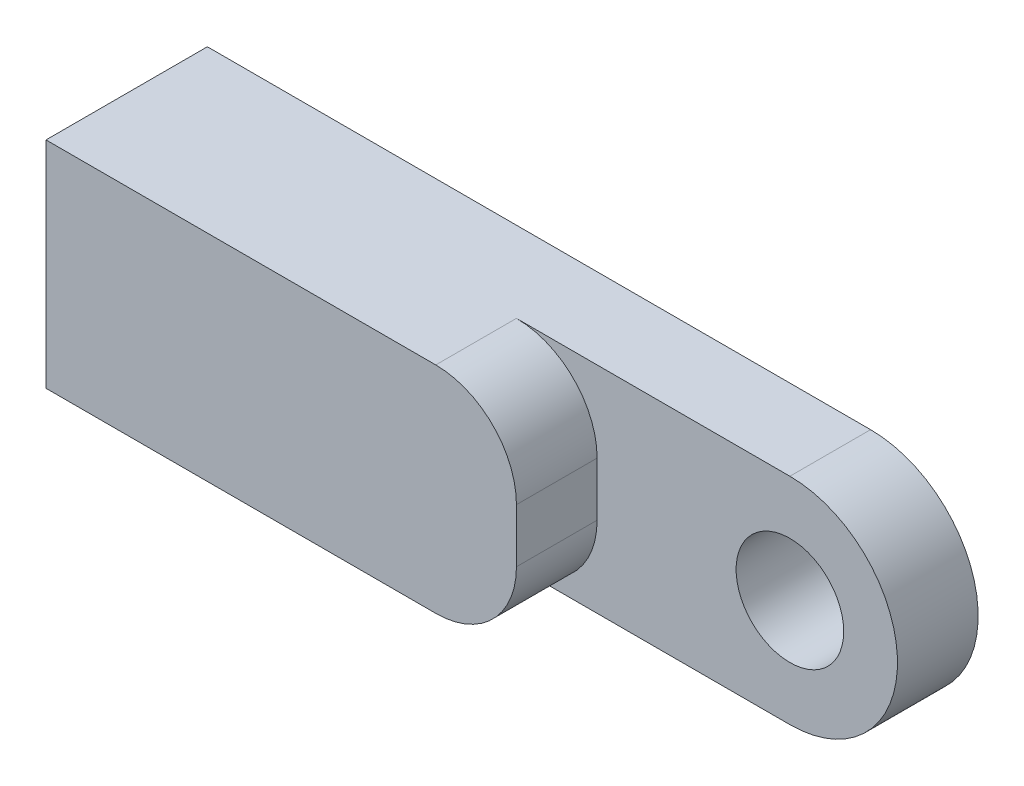
ISO-10303-21;
HEADER;
FILE_DESCRIPTION(('STEP AP214'),'2;1');
FILE_NAME('part.step','',(''),(''),'','','');
FILE_SCHEMA(('AUTOMOTIVE_DESIGN { 1 0 10303 214 1 1 1 1 }'));
ENDSEC;
DATA;
#1=APPLICATION_CONTEXT('core data for automotive mechanical design processes');
#2=APPLICATION_PROTOCOL_DEFINITION('international standard','automotive_design',2000,#1);
#3=PRODUCT_CONTEXT('',#1,'mechanical');
#4=PRODUCT('Part','Part','',(#3));
#5=PRODUCT_RELATED_PRODUCT_CATEGORY('part','',(#4));
#6=PRODUCT_DEFINITION_FORMATION('','',#4);
#7=PRODUCT_DEFINITION_CONTEXT('part definition',#1,'design');
#8=PRODUCT_DEFINITION('design','',#6,#7);
#9=PRODUCT_DEFINITION_SHAPE('','',#8);
#10=(LENGTH_UNIT() NAMED_UNIT(*) SI_UNIT(.MILLI.,.METRE.));
#11=(NAMED_UNIT(*) PLANE_ANGLE_UNIT() SI_UNIT($,.RADIAN.));
#12=(NAMED_UNIT(*) SI_UNIT($,.STERADIAN.) SOLID_ANGLE_UNIT());
#13=UNCERTAINTY_MEASURE_WITH_UNIT(LENGTH_MEASURE(1.E-05),#10,'distance_accuracy_value','');
#14=(GEOMETRIC_REPRESENTATION_CONTEXT(3) GLOBAL_UNCERTAINTY_ASSIGNED_CONTEXT((#13)) GLOBAL_UNIT_ASSIGNED_CONTEXT((#10,
#11,#12)) REPRESENTATION_CONTEXT('',''));
#15=CARTESIAN_POINT('',(0.,0.,0.));
#16=DIRECTION('',(0.,0.,1.));
#17=DIRECTION('',(1.,0.,0.));
#18=AXIS2_PLACEMENT_3D('',#15,#16,#17);
#19=CARTESIAN_POINT('',(125.,0.,60.));
#20=DIRECTION('',(0.,0.,-1.));
#21=DIRECTION('',(-1.,0.,0.));
#22=AXIS2_PLACEMENT_3D('',#19,#20,#21);
#23=CYLINDRICAL_SURFACE('',#22,40.);
#24=CARTESIAN_POINT('',(125.,0.,30.));
#25=DIRECTION('',(0.,0.,1.));
#26=DIRECTION('',(1.,0.,0.));
#27=AXIS2_PLACEMENT_3D('',#24,#25,#26);
#28=CIRCLE('',#27,40.);
#29=CARTESIAN_POINT('',(125.,-40.,30.));
#30=VERTEX_POINT('',#29);
#31=CARTESIAN_POINT('',(125.,40.,30.));
#32=VERTEX_POINT('',#31);
#33=EDGE_CURVE('E195',#30,#32,#28,.T.);
#34=ORIENTED_EDGE('',*,*,#33,.F.);
#35=DIRECTION('',(0.,0.,-1.));
#36=VECTOR('',#35,1.);
#37=CARTESIAN_POINT('',(125.,-40.,60.));
#38=LINE('',#37,#36);
#39=CARTESIAN_POINT('',(125.,-40.,0.));
#40=VERTEX_POINT('',#39);
#41=EDGE_CURVE('E149',#30,#40,#38,.T.);
#42=ORIENTED_EDGE('',*,*,#41,.T.);
#43=CARTESIAN_POINT('',(125.,0.,0.));
#44=DIRECTION('',(0.,0.,1.));
#45=DIRECTION('',(1.,0.,0.));
#46=AXIS2_PLACEMENT_3D('',#43,#44,#45);
#47=CIRCLE('',#46,40.);
#48=CARTESIAN_POINT('',(125.,40.,0.));
#49=VERTEX_POINT('',#48);
#50=EDGE_CURVE('E135',#40,#49,#47,.T.);
#51=ORIENTED_EDGE('',*,*,#50,.T.);
#52=DIRECTION('',(0.,0.,-1.));
#53=VECTOR('',#52,1.);
#54=CARTESIAN_POINT('',(125.,40.,60.));
#55=LINE('',#54,#53);
#56=EDGE_CURVE('E150',#32,#49,#55,.T.);
#57=ORIENTED_EDGE('',*,*,#56,.F.);
#58=EDGE_LOOP('',(#34,#42,#51,#57));
#59=FACE_BOUND('',#58,.T.);
#60=ADVANCED_FACE('F44',(#59),#23,.T.);
#61=CARTESIAN_POINT('',(125.,0.,60.));
#62=DIRECTION('',(0.,0.,-1.));
#63=DIRECTION('',(-1.,0.,0.));
#64=AXIS2_PLACEMENT_3D('',#61,#62,#63);
#65=CYLINDRICAL_SURFACE('',#64,20.);
#66=CARTESIAN_POINT('',(125.,0.,0.));
#67=DIRECTION('',(0.,0.,1.));
#68=DIRECTION('',(1.,0.,0.));
#69=AXIS2_PLACEMENT_3D('',#66,#67,#68);
#70=CIRCLE('',#69,20.);
#71=CARTESIAN_POINT('',(145.,0.,0.));
#72=VERTEX_POINT('',#71);
#73=EDGE_CURVE('E137',#72,#72,#70,.T.);
#74=ORIENTED_EDGE('',*,*,#73,.F.);
#75=EDGE_LOOP('',(#74));
#76=FACE_BOUND('',#75,.T.);
#77=CARTESIAN_POINT('',(125.,0.,30.));
#78=DIRECTION('',(0.,0.,1.));
#79=DIRECTION('',(1.,0.,0.));
#80=AXIS2_PLACEMENT_3D('',#77,#78,#79);
#81=CIRCLE('',#80,20.);
#82=CARTESIAN_POINT('',(145.,0.,30.));
#83=VERTEX_POINT('',#82);
#84=EDGE_CURVE('E151',#83,#83,#81,.T.);
#85=ORIENTED_EDGE('',*,*,#84,.T.);
#86=EDGE_LOOP('',(#85));
#87=FACE_BOUND('',#86,.T.);
#88=ADVANCED_FACE('F206',(#76,#87),#65,.F.);
#89=CARTESIAN_POINT('',(-150.,0.,60.));
#90=DIRECTION('',(0.,0.,1.));
#91=DIRECTION('',(1.,0.,0.));
#92=AXIS2_PLACEMENT_3D('',#89,#90,#91);
#93=PLANE('',#92);
#94=DIRECTION('',(0.,-1.,0.));
#95=VECTOR('',#94,1.);
#96=CARTESIAN_POINT('',(53.3156408290106,-40.,60.));
#97=LINE('',#96,#95);
#98=CARTESIAN_POINT('',(53.3156408290106,10.,60.));
#99=VERTEX_POINT('',#98);
#100=CARTESIAN_POINT('',(53.3156408290106,-10.,60.));
#101=VERTEX_POINT('',#100);
#102=EDGE_CURVE('E185',#99,#101,#97,.T.);
#103=ORIENTED_EDGE('',*,*,#102,.F.);
#104=CARTESIAN_POINT('',(23.3156408290106,10.,60.));
#105=DIRECTION('',(0.,0.,1.));
#106=DIRECTION('',(1.,0.,0.));
#107=AXIS2_PLACEMENT_3D('',#104,#105,#106);
#108=CIRCLE('',#107,30.);
#109=CARTESIAN_POINT('',(23.3156408290106,40.,60.));
#110=VERTEX_POINT('',#109);
#111=EDGE_CURVE('E165',#99,#110,#108,.T.);
#112=ORIENTED_EDGE('',*,*,#111,.T.);
#113=DIRECTION('',(-1.,0.,0.));
#114=VECTOR('',#113,1.);
#115=CARTESIAN_POINT('',(-150.,40.,60.));
#116=LINE('',#115,#114);
#117=CARTESIAN_POINT('',(-121.611968519616,40.,60.));
#118=VERTEX_POINT('',#117);
#119=EDGE_CURVE('E141',#110,#118,#116,.T.);
#120=ORIENTED_EDGE('',*,*,#119,.T.);
#121=DIRECTION('',(0.,-1.,0.));
#122=VECTOR('',#121,1.);
#123=CARTESIAN_POINT('',(-121.611968519616,91.0000000000001,60.));
#124=LINE('',#123,#122);
#125=CARTESIAN_POINT('',(-121.611968519616,-40.,60.));
#126=VERTEX_POINT('',#125);
#127=EDGE_CURVE('E122',#118,#126,#124,.T.);
#128=ORIENTED_EDGE('',*,*,#127,.T.);
#129=DIRECTION('',(1.,0.,0.));
#130=VECTOR('',#129,1.);
#131=CARTESIAN_POINT('',(-150.,-40.,60.));
#132=LINE('',#131,#130);
#133=CARTESIAN_POINT('',(23.3156408290106,-40.,60.));
#134=VERTEX_POINT('',#133);
#135=EDGE_CURVE('E126',#126,#134,#132,.T.);
#136=ORIENTED_EDGE('',*,*,#135,.T.);
#137=CARTESIAN_POINT('',(23.3156408290106,-10.,60.));
#138=DIRECTION('',(0.,0.,1.));
#139=DIRECTION('',(1.,0.,0.));
#140=AXIS2_PLACEMENT_3D('',#137,#138,#139);
#141=CIRCLE('',#140,30.);
#142=EDGE_CURVE('E159',#134,#101,#141,.T.);
#143=ORIENTED_EDGE('',*,*,#142,.T.);
#144=EDGE_LOOP('',(#103,#112,#120,#128,#136,#143));
#145=FACE_BOUND('',#144,.T.);
#146=ADVANCED_FACE('F187',(#145),#93,.T.);
#147=CARTESIAN_POINT('',(-150.,0.,0.));
#148=DIRECTION('',(0.,0.,1.));
#149=DIRECTION('',(1.,0.,0.));
#150=AXIS2_PLACEMENT_3D('',#147,#148,#149);
#151=PLANE('',#150);
#152=DIRECTION('',(1.,0.,0.));
#153=VECTOR('',#152,1.);
#154=CARTESIAN_POINT('',(-150.,-40.,0.));
#155=LINE('',#154,#153);
#156=CARTESIAN_POINT('',(-121.611968519616,-40.,0.));
#157=VERTEX_POINT('',#156);
#158=EDGE_CURVE('E121',#157,#40,#155,.T.);
#159=ORIENTED_EDGE('',*,*,#158,.F.);
#160=DIRECTION('',(0.,-1.,0.));
#161=VECTOR('',#160,1.);
#162=CARTESIAN_POINT('',(-121.611968519616,91.0000000000001,0.));
#163=LINE('',#162,#161);
#164=CARTESIAN_POINT('',(-121.611968519616,40.,0.));
#165=VERTEX_POINT('',#164);
#166=EDGE_CURVE('E108',#165,#157,#163,.T.);
#167=ORIENTED_EDGE('',*,*,#166,.F.);
#168=DIRECTION('',(-1.,0.,0.));
#169=VECTOR('',#168,1.);
#170=CARTESIAN_POINT('',(-150.,40.,0.));
#171=LINE('',#170,#169);
#172=EDGE_CURVE('E138',#49,#165,#171,.T.);
#173=ORIENTED_EDGE('',*,*,#172,.F.);
#174=ORIENTED_EDGE('',*,*,#50,.F.);
#175=EDGE_LOOP('',(#159,#167,#173,#174));
#176=FACE_BOUND('',#175,.T.);
#177=ORIENTED_EDGE('',*,*,#73,.T.);
#178=EDGE_LOOP('',(#177));
#179=FACE_BOUND('',#178,.T.);
#180=ADVANCED_FACE('F132',(#176,#179),#151,.F.);
#181=CARTESIAN_POINT('',(-150.,-40.,60.));
#182=DIRECTION('',(0.,1.,0.));
#183=DIRECTION('',(0.,0.,1.));
#184=AXIS2_PLACEMENT_3D('',#181,#182,#183);
#185=PLANE('',#184);
#186=DIRECTION('',(1.,0.,0.));
#187=VECTOR('',#186,1.);
#188=CARTESIAN_POINT('',(-150.,-40.,30.));
#189=LINE('',#188,#187);
#190=CARTESIAN_POINT('',(23.3156408290106,-40.,30.));
#191=VERTEX_POINT('',#190);
#192=EDGE_CURVE('E58',#191,#30,#189,.T.);
#193=ORIENTED_EDGE('',*,*,#192,.F.);
#194=DIRECTION('',(0.,0.,1.));
#195=VECTOR('',#194,1.);
#196=CARTESIAN_POINT('',(23.3156408290106,-40.,60.));
#197=LINE('',#196,#195);
#198=EDGE_CURVE('E167',#191,#134,#197,.T.);
#199=ORIENTED_EDGE('',*,*,#198,.T.);
#200=ORIENTED_EDGE('',*,*,#135,.F.);
#201=DIRECTION('',(0.,0.,1.));
#202=VECTOR('',#201,1.);
#203=CARTESIAN_POINT('',(-121.611968519616,-40.,0.));
#204=LINE('',#203,#202);
#205=EDGE_CURVE('E114',#157,#126,#204,.T.);
#206=ORIENTED_EDGE('',*,*,#205,.F.);
#207=ORIENTED_EDGE('',*,*,#158,.T.);
#208=ORIENTED_EDGE('',*,*,#41,.F.);
#209=EDGE_LOOP('',(#193,#199,#200,#206,#207,#208));
#210=FACE_BOUND('',#209,.T.);
#211=ADVANCED_FACE('F124',(#210),#185,.F.);
#212=CARTESIAN_POINT('',(-150.,40.,60.));
#213=DIRECTION('',(0.,-1.,0.));
#214=DIRECTION('',(0.,0.,-1.));
#215=AXIS2_PLACEMENT_3D('',#212,#213,#214);
#216=PLANE('',#215);
#217=ORIENTED_EDGE('',*,*,#119,.F.);
#218=DIRECTION('',(0.,0.,1.));
#219=VECTOR('',#218,1.);
#220=CARTESIAN_POINT('',(23.3156408290106,40.,60.));
#221=LINE('',#220,#219);
#222=CARTESIAN_POINT('',(23.3156408290106,40.,30.));
#223=VERTEX_POINT('',#222);
#224=EDGE_CURVE('E163',#110,#223,#221,.F.);
#225=ORIENTED_EDGE('',*,*,#224,.T.);
#226=DIRECTION('',(-1.,0.,0.));
#227=VECTOR('',#226,1.);
#228=CARTESIAN_POINT('',(-150.,40.,30.));
#229=LINE('',#228,#227);
#230=EDGE_CURVE('E70',#32,#223,#229,.T.);
#231=ORIENTED_EDGE('',*,*,#230,.F.);
#232=ORIENTED_EDGE('',*,*,#56,.T.);
#233=ORIENTED_EDGE('',*,*,#172,.T.);
#234=DIRECTION('',(0.,0.,1.));
#235=VECTOR('',#234,1.);
#236=CARTESIAN_POINT('',(-121.611968519616,40.,60.));
#237=LINE('',#236,#235);
#238=EDGE_CURVE('E116',#165,#118,#237,.T.);
#239=ORIENTED_EDGE('',*,*,#238,.T.);
#240=EDGE_LOOP('',(#217,#225,#231,#232,#233,#239));
#241=FACE_BOUND('',#240,.T.);
#242=ADVANCED_FACE('F188',(#241),#216,.F.);
#243=CARTESIAN_POINT('',(125.,0.,30.));
#244=DIRECTION('',(0.,0.,1.));
#245=DIRECTION('',(1.,0.,0.));
#246=AXIS2_PLACEMENT_3D('',#243,#244,#245);
#247=PLANE('',#246);
#248=ORIENTED_EDGE('',*,*,#84,.F.);
#249=EDGE_LOOP('',(#248));
#250=FACE_BOUND('',#249,.T.);
#251=ORIENTED_EDGE('',*,*,#192,.T.);
#252=ORIENTED_EDGE('',*,*,#33,.T.);
#253=ORIENTED_EDGE('',*,*,#230,.T.);
#254=CARTESIAN_POINT('',(23.3156408290106,10.,30.));
#255=DIRECTION('',(0.,0.,1.));
#256=DIRECTION('',(1.,0.,0.));
#257=AXIS2_PLACEMENT_3D('',#254,#255,#256);
#258=CIRCLE('',#257,30.);
#259=CARTESIAN_POINT('',(53.3156408290106,10.,30.));
#260=VERTEX_POINT('',#259);
#261=EDGE_CURVE('E52',#223,#260,#258,.F.);
#262=ORIENTED_EDGE('',*,*,#261,.T.);
#263=DIRECTION('',(0.,-1.,0.));
#264=VECTOR('',#263,1.);
#265=CARTESIAN_POINT('',(53.3156408290106,-40.,30.));
#266=LINE('',#265,#264);
#267=CARTESIAN_POINT('',(53.3156408290106,-10.,30.));
#268=VERTEX_POINT('',#267);
#269=EDGE_CURVE('E171',#260,#268,#266,.T.);
#270=ORIENTED_EDGE('',*,*,#269,.T.);
#271=CARTESIAN_POINT('',(23.3156408290106,-10.,30.));
#272=DIRECTION('',(0.,0.,1.));
#273=DIRECTION('',(1.,0.,0.));
#274=AXIS2_PLACEMENT_3D('',#271,#272,#273);
#275=CIRCLE('',#274,30.);
#276=EDGE_CURVE('E11',#268,#191,#275,.F.);
#277=ORIENTED_EDGE('',*,*,#276,.T.);
#278=EDGE_LOOP('',(#251,#252,#253,#262,#270,#277));
#279=FACE_BOUND('',#278,.T.);
#280=ADVANCED_FACE('F168',(#250,#279),#247,.T.);
#281=CARTESIAN_POINT('',(-121.611968519616,91.0000000000001,0.));
#282=DIRECTION('',(1.,0.,0.));
#283=DIRECTION('',(0.,0.,-1.));
#284=AXIS2_PLACEMENT_3D('',#281,#282,#283);
#285=PLANE('',#284);
#286=CARTESIAN_POINT('',(-121.611968519616,0.,30.));
#287=DIRECTION('',(-1.,0.,0.));
#288=DIRECTION('',(0.,0.,1.));
#289=AXIS2_PLACEMENT_3D('',#286,#287,#288);
#290=CIRCLE('',#289,7.5);
#291=CARTESIAN_POINT('',(-121.611968519616,0.,37.5));
#292=VERTEX_POINT('',#291);
#293=EDGE_CURVE('E182',#292,#292,#290,.T.);
#294=ORIENTED_EDGE('',*,*,#293,.F.);
#295=EDGE_LOOP('',(#294));
#296=FACE_BOUND('',#295,.T.);
#297=ORIENTED_EDGE('',*,*,#166,.T.);
#298=ORIENTED_EDGE('',*,*,#205,.T.);
#299=ORIENTED_EDGE('',*,*,#127,.F.);
#300=ORIENTED_EDGE('',*,*,#238,.F.);
#301=EDGE_LOOP('',(#297,#298,#299,#300));
#302=FACE_BOUND('',#301,.T.);
#303=ADVANCED_FACE('F112',(#296,#302),#285,.F.);
#304=CARTESIAN_POINT('',(-111.611968519616,0.,30.));
#305=DIRECTION('',(-1.,0.,0.));
#306=DIRECTION('',(0.,0.,1.));
#307=AXIS2_PLACEMENT_3D('',#304,#305,#306);
#308=CYLINDRICAL_SURFACE('',#307,7.5);
#309=CARTESIAN_POINT('',(-111.611968519616,0.,30.));
#310=DIRECTION('',(-1.,0.,0.));
#311=DIRECTION('',(0.,0.,1.));
#312=AXIS2_PLACEMENT_3D('',#309,#310,#311);
#313=CIRCLE('',#312,7.5);
#314=CARTESIAN_POINT('',(-111.611968519616,0.,37.5));
#315=VERTEX_POINT('',#314);
#316=EDGE_CURVE('E129',#315,#315,#313,.T.);
#317=ORIENTED_EDGE('',*,*,#316,.F.);
#318=EDGE_LOOP('',(#317));
#319=FACE_BOUND('',#318,.T.);
#320=ORIENTED_EDGE('',*,*,#293,.T.);
#321=EDGE_LOOP('',(#320));
#322=FACE_BOUND('',#321,.T.);
#323=ADVANCED_FACE('F228',(#319,#322),#308,.F.);
#324=CARTESIAN_POINT('',(-111.611968519616,0.,30.));
#325=DIRECTION('',(-1.,0.,0.));
#326=DIRECTION('',(0.,0.,1.));
#327=AXIS2_PLACEMENT_3D('',#324,#325,#326);
#328=PLANE('',#327);
#329=ORIENTED_EDGE('',*,*,#316,.T.);
#330=EDGE_LOOP('',(#329));
#331=FACE_BOUND('',#330,.T.);
#332=ADVANCED_FACE('F224',(#331),#328,.T.);
#333=CARTESIAN_POINT('',(53.3156408290106,-40.,30.));
#334=DIRECTION('',(-1.,0.,0.));
#335=DIRECTION('',(0.,0.,1.));
#336=AXIS2_PLACEMENT_3D('',#333,#334,#335);
#337=PLANE('',#336);
#338=ORIENTED_EDGE('',*,*,#269,.F.);
#339=DIRECTION('',(0.,0.,1.));
#340=VECTOR('',#339,1.);
#341=CARTESIAN_POINT('',(53.3156408290106,10.,30.));
#342=LINE('',#341,#340);
#343=EDGE_CURVE('E160',#260,#99,#342,.T.);
#344=ORIENTED_EDGE('',*,*,#343,.T.);
#345=ORIENTED_EDGE('',*,*,#102,.T.);
#346=DIRECTION('',(0.,0.,1.));
#347=VECTOR('',#346,1.);
#348=CARTESIAN_POINT('',(53.3156408290106,-10.,30.));
#349=LINE('',#348,#347);
#350=EDGE_CURVE('E154',#101,#268,#349,.F.);
#351=ORIENTED_EDGE('',*,*,#350,.T.);
#352=EDGE_LOOP('',(#338,#344,#345,#351));
#353=FACE_BOUND('',#352,.T.);
#354=ADVANCED_FACE('F180',(#353),#337,.F.);
#355=CARTESIAN_POINT('',(23.3156408290106,10.,30.));
#356=DIRECTION('',(0.,0.,1.));
#357=DIRECTION('',(1.,0.,0.));
#358=AXIS2_PLACEMENT_3D('',#355,#356,#357);
#359=CYLINDRICAL_SURFACE('',#358,30.);
#360=ORIENTED_EDGE('',*,*,#261,.F.);
#361=ORIENTED_EDGE('',*,*,#224,.F.);
#362=ORIENTED_EDGE('',*,*,#111,.F.);
#363=ORIENTED_EDGE('',*,*,#343,.F.);
#364=EDGE_LOOP('',(#360,#361,#362,#363));
#365=FACE_BOUND('',#364,.T.);
#366=ADVANCED_FACE('F184',(#365),#359,.T.);
#367=CARTESIAN_POINT('',(23.3156408290106,-10.,60.));
#368=DIRECTION('',(0.,0.,1.));
#369=DIRECTION('',(1.,0.,0.));
#370=AXIS2_PLACEMENT_3D('',#367,#368,#369);
#371=CYLINDRICAL_SURFACE('',#370,30.);
#372=ORIENTED_EDGE('',*,*,#276,.F.);
#373=ORIENTED_EDGE('',*,*,#350,.F.);
#374=ORIENTED_EDGE('',*,*,#142,.F.);
#375=ORIENTED_EDGE('',*,*,#198,.F.);
#376=EDGE_LOOP('',(#372,#373,#374,#375));
#377=FACE_BOUND('',#376,.T.);
#378=ADVANCED_FACE('F50',(#377),#371,.T.);
#379=CLOSED_SHELL('',(#60,#88,#146,#180,#211,#242,#280,#303,#323,#332,#354,#366,#378));
#380=MANIFOLD_SOLID_BREP('B2',#379);
#381=ADVANCED_BREP_SHAPE_REPRESENTATION('',(#18,#380),#14);
#382=SHAPE_DEFINITION_REPRESENTATION(#9,#381);
ENDSEC;
END-ISO-10303-21;
